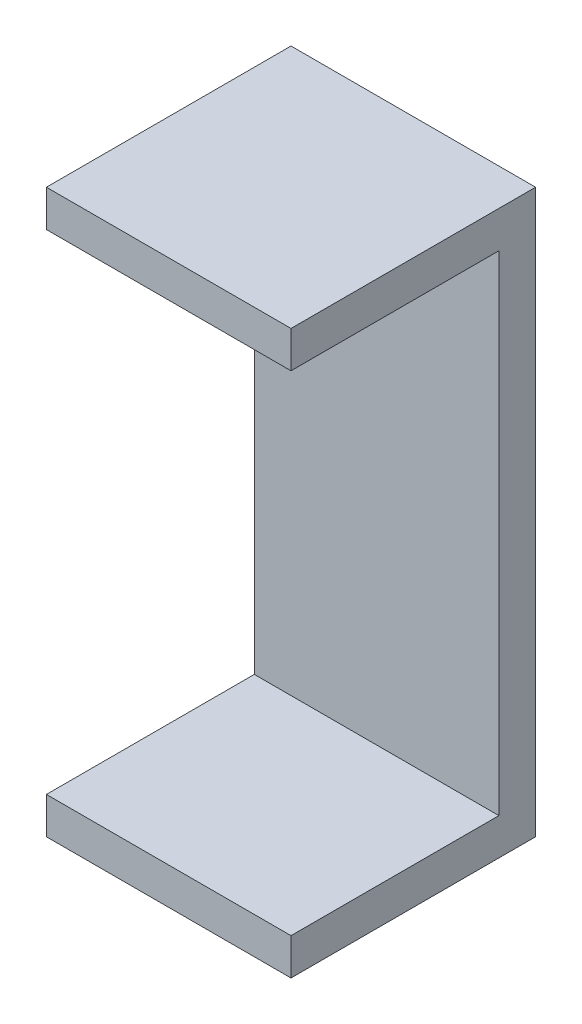
ISO-10303-21;
HEADER;
FILE_DESCRIPTION(('STEP AP214'),'2;1');
FILE_NAME('part.step','',(''),(''),'','','');
FILE_SCHEMA(('AUTOMOTIVE_DESIGN { 1 0 10303 214 1 1 1 1 }'));
ENDSEC;
DATA;
#1=APPLICATION_CONTEXT('core data for automotive mechanical design processes');
#2=APPLICATION_PROTOCOL_DEFINITION('international standard','automotive_design',2000,#1);
#3=PRODUCT_CONTEXT('',#1,'mechanical');
#4=PRODUCT('Part','Part','',(#3));
#5=PRODUCT_RELATED_PRODUCT_CATEGORY('part','',(#4));
#6=PRODUCT_DEFINITION_FORMATION('','',#4);
#7=PRODUCT_DEFINITION_CONTEXT('part definition',#1,'design');
#8=PRODUCT_DEFINITION('design','',#6,#7);
#9=PRODUCT_DEFINITION_SHAPE('','',#8);
#10=(LENGTH_UNIT() NAMED_UNIT(*) SI_UNIT(.MILLI.,.METRE.));
#11=(NAMED_UNIT(*) PLANE_ANGLE_UNIT() SI_UNIT($,.RADIAN.));
#12=(NAMED_UNIT(*) SI_UNIT($,.STERADIAN.) SOLID_ANGLE_UNIT());
#13=UNCERTAINTY_MEASURE_WITH_UNIT(LENGTH_MEASURE(1.E-05),#10,'distance_accuracy_value','');
#14=(GEOMETRIC_REPRESENTATION_CONTEXT(3) GLOBAL_UNCERTAINTY_ASSIGNED_CONTEXT((#13)) GLOBAL_UNIT_ASSIGNED_CONTEXT((#10,
#11,#12)) REPRESENTATION_CONTEXT('',''));
#15=CARTESIAN_POINT('',(0.,0.,0.));
#16=DIRECTION('',(0.,0.,1.));
#17=DIRECTION('',(1.,0.,0.));
#18=AXIS2_PLACEMENT_3D('',#15,#16,#17);
#19=CARTESIAN_POINT('',(10.,20.,3.));
#20=DIRECTION('',(-1.,0.,0.));
#21=DIRECTION('',(0.,-1.,0.));
#22=AXIS2_PLACEMENT_3D('',#19,#20,#21);
#23=PLANE('',#22);
#24=DIRECTION('',(0.,1.,0.));
#25=VECTOR('',#24,1.);
#26=CARTESIAN_POINT('',(10.,20.,0.));
#27=LINE('',#26,#25);
#28=CARTESIAN_POINT('',(10.,-23.,0.));
#29=VERTEX_POINT('',#28);
#30=CARTESIAN_POINT('',(10.,23.,0.));
#31=VERTEX_POINT('',#30);
#32=EDGE_CURVE('E151',#29,#31,#27,.T.);
#33=ORIENTED_EDGE('',*,*,#32,.T.);
#34=DIRECTION('',(0.,0.,-1.));
#35=VECTOR('',#34,1.);
#36=CARTESIAN_POINT('',(10.,23.,20.));
#37=LINE('',#36,#35);
#38=CARTESIAN_POINT('',(10.,23.,20.));
#39=VERTEX_POINT('',#38);
#40=EDGE_CURVE('E148',#39,#31,#37,.T.);
#41=ORIENTED_EDGE('',*,*,#40,.F.);
#42=DIRECTION('',(0.,-1.,0.));
#43=VECTOR('',#42,1.);
#44=CARTESIAN_POINT('',(10.,20.,20.));
#45=LINE('',#44,#43);
#46=CARTESIAN_POINT('',(10.,20.,20.));
#47=VERTEX_POINT('',#46);
#48=EDGE_CURVE('E134',#39,#47,#45,.T.);
#49=ORIENTED_EDGE('',*,*,#48,.T.);
#50=DIRECTION('',(0.,0.,-1.));
#51=VECTOR('',#50,1.);
#52=CARTESIAN_POINT('',(10.,20.,20.));
#53=LINE('',#52,#51);
#54=CARTESIAN_POINT('',(10.,20.,3.));
#55=VERTEX_POINT('',#54);
#56=EDGE_CURVE('E145',#47,#55,#53,.T.);
#57=ORIENTED_EDGE('',*,*,#56,.T.);
#58=DIRECTION('',(0.,1.,0.));
#59=VECTOR('',#58,1.);
#60=CARTESIAN_POINT('',(10.,20.,3.));
#61=LINE('',#60,#59);
#62=CARTESIAN_POINT('',(10.,-20.,3.));
#63=VERTEX_POINT('',#62);
#64=EDGE_CURVE('E158',#63,#55,#61,.T.);
#65=ORIENTED_EDGE('',*,*,#64,.F.);
#66=DIRECTION('',(0.,0.,-1.));
#67=VECTOR('',#66,1.);
#68=CARTESIAN_POINT('',(10.,-20.,20.));
#69=LINE('',#68,#67);
#70=CARTESIAN_POINT('',(10.,-20.,20.));
#71=VERTEX_POINT('',#70);
#72=EDGE_CURVE('E51',#71,#63,#69,.T.);
#73=ORIENTED_EDGE('',*,*,#72,.F.);
#74=DIRECTION('',(0.,-1.,0.));
#75=VECTOR('',#74,1.);
#76=CARTESIAN_POINT('',(10.,-20.,20.));
#77=LINE('',#76,#75);
#78=CARTESIAN_POINT('',(10.,-23.,20.));
#79=VERTEX_POINT('',#78);
#80=EDGE_CURVE('E118',#71,#79,#77,.T.);
#81=ORIENTED_EDGE('',*,*,#80,.T.);
#82=DIRECTION('',(0.,0.,-1.));
#83=VECTOR('',#82,1.);
#84=CARTESIAN_POINT('',(10.,-23.,20.));
#85=LINE('',#84,#83);
#86=EDGE_CURVE('E101',#79,#29,#85,.T.);
#87=ORIENTED_EDGE('',*,*,#86,.T.);
#88=EDGE_LOOP('',(#33,#41,#49,#57,#65,#73,#81,#87));
#89=FACE_BOUND('',#88,.T.);
#90=ADVANCED_FACE('F35',(#89),#23,.F.);
#91=CARTESIAN_POINT('',(-10.,20.,3.));
#92=DIRECTION('',(1.,0.,0.));
#93=DIRECTION('',(0.,1.,0.));
#94=AXIS2_PLACEMENT_3D('',#91,#92,#93);
#95=PLANE('',#94);
#96=DIRECTION('',(0.,-1.,0.));
#97=VECTOR('',#96,1.);
#98=CARTESIAN_POINT('',(-10.,20.,0.));
#99=LINE('',#98,#97);
#100=CARTESIAN_POINT('',(-10.,23.,0.));
#101=VERTEX_POINT('',#100);
#102=CARTESIAN_POINT('',(-10.,-23.,0.));
#103=VERTEX_POINT('',#102);
#104=EDGE_CURVE('E38',#101,#103,#99,.T.);
#105=ORIENTED_EDGE('',*,*,#104,.T.);
#106=DIRECTION('',(0.,0.,-1.));
#107=VECTOR('',#106,1.);
#108=CARTESIAN_POINT('',(-10.,-23.,20.));
#109=LINE('',#108,#107);
#110=CARTESIAN_POINT('',(-10.,-23.,20.));
#111=VERTEX_POINT('',#110);
#112=EDGE_CURVE('E110',#111,#103,#109,.T.);
#113=ORIENTED_EDGE('',*,*,#112,.F.);
#114=DIRECTION('',(0.,1.,0.));
#115=VECTOR('',#114,1.);
#116=CARTESIAN_POINT('',(-10.,-20.,20.));
#117=LINE('',#116,#115);
#118=CARTESIAN_POINT('',(-10.,-20.,20.));
#119=VERTEX_POINT('',#118);
#120=EDGE_CURVE('E120',#111,#119,#117,.T.);
#121=ORIENTED_EDGE('',*,*,#120,.T.);
#122=DIRECTION('',(0.,0.,-1.));
#123=VECTOR('',#122,1.);
#124=CARTESIAN_POINT('',(-10.,-20.,20.));
#125=LINE('',#124,#123);
#126=CARTESIAN_POINT('',(-10.,-20.,3.));
#127=VERTEX_POINT('',#126);
#128=EDGE_CURVE('E130',#119,#127,#125,.T.);
#129=ORIENTED_EDGE('',*,*,#128,.T.);
#130=DIRECTION('',(0.,-1.,0.));
#131=VECTOR('',#130,1.);
#132=CARTESIAN_POINT('',(-10.,20.,3.));
#133=LINE('',#132,#131);
#134=CARTESIAN_POINT('',(-10.,20.,3.));
#135=VERTEX_POINT('',#134);
#136=EDGE_CURVE('E43',#135,#127,#133,.T.);
#137=ORIENTED_EDGE('',*,*,#136,.F.);
#138=DIRECTION('',(0.,0.,-1.));
#139=VECTOR('',#138,1.);
#140=CARTESIAN_POINT('',(-10.,20.,20.));
#141=LINE('',#140,#139);
#142=CARTESIAN_POINT('',(-10.,20.,20.));
#143=VERTEX_POINT('',#142);
#144=EDGE_CURVE('E58',#143,#135,#141,.T.);
#145=ORIENTED_EDGE('',*,*,#144,.F.);
#146=DIRECTION('',(0.,1.,0.));
#147=VECTOR('',#146,1.);
#148=CARTESIAN_POINT('',(-10.,20.,20.));
#149=LINE('',#148,#147);
#150=CARTESIAN_POINT('',(-10.,23.,20.));
#151=VERTEX_POINT('',#150);
#152=EDGE_CURVE('E139',#143,#151,#149,.T.);
#153=ORIENTED_EDGE('',*,*,#152,.T.);
#154=DIRECTION('',(0.,0.,-1.));
#155=VECTOR('',#154,1.);
#156=CARTESIAN_POINT('',(-10.,23.,20.));
#157=LINE('',#156,#155);
#158=EDGE_CURVE('E152',#151,#101,#157,.T.);
#159=ORIENTED_EDGE('',*,*,#158,.T.);
#160=EDGE_LOOP('',(#105,#113,#121,#129,#137,#145,#153,#159));
#161=FACE_BOUND('',#160,.T.);
#162=ADVANCED_FACE('F165',(#161),#95,.F.);
#163=CARTESIAN_POINT('',(0.,0.,3.));
#164=DIRECTION('',(0.,0.,1.));
#165=DIRECTION('',(1.,0.,0.));
#166=AXIS2_PLACEMENT_3D('',#163,#164,#165);
#167=PLANE('',#166);
#168=ORIENTED_EDGE('',*,*,#64,.T.);
#169=DIRECTION('',(-1.,0.,0.));
#170=VECTOR('',#169,1.);
#171=CARTESIAN_POINT('',(-10.,20.,3.));
#172=LINE('',#171,#170);
#173=EDGE_CURVE('E161',#55,#135,#172,.T.);
#174=ORIENTED_EDGE('',*,*,#173,.T.);
#175=ORIENTED_EDGE('',*,*,#136,.T.);
#176=DIRECTION('',(1.,0.,0.));
#177=VECTOR('',#176,1.);
#178=CARTESIAN_POINT('',(-10.,-20.,3.));
#179=LINE('',#178,#177);
#180=EDGE_CURVE('E11',#127,#63,#179,.T.);
#181=ORIENTED_EDGE('',*,*,#180,.T.);
#182=EDGE_LOOP('',(#168,#174,#175,#181));
#183=FACE_BOUND('',#182,.T.);
#184=ADVANCED_FACE('F179',(#183),#167,.T.);
#185=CARTESIAN_POINT('',(0.,0.,0.));
#186=DIRECTION('',(0.,0.,1.));
#187=DIRECTION('',(1.,0.,0.));
#188=AXIS2_PLACEMENT_3D('',#185,#186,#187);
#189=PLANE('',#188);
#190=ORIENTED_EDGE('',*,*,#32,.F.);
#191=DIRECTION('',(-1.,0.,0.));
#192=VECTOR('',#191,1.);
#193=CARTESIAN_POINT('',(10.,-23.,0.));
#194=LINE('',#193,#192);
#195=EDGE_CURVE('E107',#29,#103,#194,.T.);
#196=ORIENTED_EDGE('',*,*,#195,.T.);
#197=ORIENTED_EDGE('',*,*,#104,.F.);
#198=DIRECTION('',(1.,0.,0.));
#199=VECTOR('',#198,1.);
#200=CARTESIAN_POINT('',(10.,23.,0.));
#201=LINE('',#200,#199);
#202=EDGE_CURVE('E129',#101,#31,#201,.T.);
#203=ORIENTED_EDGE('',*,*,#202,.T.);
#204=EDGE_LOOP('',(#190,#196,#197,#203));
#205=FACE_BOUND('',#204,.T.);
#206=ADVANCED_FACE('F168',(#205),#189,.F.);
#207=CARTESIAN_POINT('',(10.,20.,20.));
#208=DIRECTION('',(0.,-1.,0.));
#209=DIRECTION('',(0.,0.,-1.));
#210=AXIS2_PLACEMENT_3D('',#207,#208,#209);
#211=PLANE('',#210);
#212=ORIENTED_EDGE('',*,*,#173,.F.);
#213=ORIENTED_EDGE('',*,*,#56,.F.);
#214=DIRECTION('',(-1.,0.,0.));
#215=VECTOR('',#214,1.);
#216=CARTESIAN_POINT('',(10.,20.,20.));
#217=LINE('',#216,#215);
#218=EDGE_CURVE('E137',#47,#143,#217,.T.);
#219=ORIENTED_EDGE('',*,*,#218,.T.);
#220=ORIENTED_EDGE('',*,*,#144,.T.);
#221=EDGE_LOOP('',(#212,#213,#219,#220));
#222=FACE_BOUND('',#221,.T.);
#223=ADVANCED_FACE('F177',(#222),#211,.T.);
#224=CARTESIAN_POINT('',(10.,23.,20.));
#225=DIRECTION('',(0.,1.,0.));
#226=DIRECTION('',(0.,0.,1.));
#227=AXIS2_PLACEMENT_3D('',#224,#225,#226);
#228=PLANE('',#227);
#229=ORIENTED_EDGE('',*,*,#202,.F.);
#230=ORIENTED_EDGE('',*,*,#158,.F.);
#231=DIRECTION('',(1.,0.,0.));
#232=VECTOR('',#231,1.);
#233=CARTESIAN_POINT('',(10.,23.,20.));
#234=LINE('',#233,#232);
#235=EDGE_CURVE('E142',#151,#39,#234,.T.);
#236=ORIENTED_EDGE('',*,*,#235,.T.);
#237=ORIENTED_EDGE('',*,*,#40,.T.);
#238=EDGE_LOOP('',(#229,#230,#236,#237));
#239=FACE_BOUND('',#238,.T.);
#240=ADVANCED_FACE('F170',(#239),#228,.T.);
#241=CARTESIAN_POINT('',(0.,0.,20.));
#242=DIRECTION('',(0.,0.,1.));
#243=DIRECTION('',(1.,0.,0.));
#244=AXIS2_PLACEMENT_3D('',#241,#242,#243);
#245=PLANE('',#244);
#246=ORIENTED_EDGE('',*,*,#48,.F.);
#247=ORIENTED_EDGE('',*,*,#235,.F.);
#248=ORIENTED_EDGE('',*,*,#152,.F.);
#249=ORIENTED_EDGE('',*,*,#218,.F.);
#250=EDGE_LOOP('',(#246,#247,#248,#249));
#251=FACE_BOUND('',#250,.T.);
#252=ADVANCED_FACE('F175',(#251),#245,.T.);
#253=CARTESIAN_POINT('',(10.,-20.,20.));
#254=DIRECTION('',(0.,1.,0.));
#255=DIRECTION('',(0.,0.,1.));
#256=AXIS2_PLACEMENT_3D('',#253,#254,#255);
#257=PLANE('',#256);
#258=ORIENTED_EDGE('',*,*,#180,.F.);
#259=ORIENTED_EDGE('',*,*,#128,.F.);
#260=DIRECTION('',(1.,0.,0.));
#261=VECTOR('',#260,1.);
#262=CARTESIAN_POINT('',(10.,-20.,20.));
#263=LINE('',#262,#261);
#264=EDGE_CURVE('E111',#119,#71,#263,.T.);
#265=ORIENTED_EDGE('',*,*,#264,.T.);
#266=ORIENTED_EDGE('',*,*,#72,.T.);
#267=EDGE_LOOP('',(#258,#259,#265,#266));
#268=FACE_BOUND('',#267,.T.);
#269=ADVANCED_FACE('F181',(#268),#257,.T.);
#270=CARTESIAN_POINT('',(10.,-23.,20.));
#271=DIRECTION('',(0.,-1.,0.));
#272=DIRECTION('',(0.,0.,-1.));
#273=AXIS2_PLACEMENT_3D('',#270,#271,#272);
#274=PLANE('',#273);
#275=ORIENTED_EDGE('',*,*,#195,.F.);
#276=ORIENTED_EDGE('',*,*,#86,.F.);
#277=DIRECTION('',(-1.,0.,0.));
#278=VECTOR('',#277,1.);
#279=CARTESIAN_POINT('',(10.,-23.,20.));
#280=LINE('',#279,#278);
#281=EDGE_CURVE('E105',#79,#111,#280,.T.);
#282=ORIENTED_EDGE('',*,*,#281,.T.);
#283=ORIENTED_EDGE('',*,*,#112,.T.);
#284=EDGE_LOOP('',(#275,#276,#282,#283));
#285=FACE_BOUND('',#284,.T.);
#286=ADVANCED_FACE('F103',(#285),#274,.T.);
#287=CARTESIAN_POINT('',(0.,0.,20.));
#288=DIRECTION('',(0.,0.,-1.));
#289=DIRECTION('',(-1.,0.,0.));
#290=AXIS2_PLACEMENT_3D('',#287,#288,#289);
#291=PLANE('',#290);
#292=ORIENTED_EDGE('',*,*,#80,.F.);
#293=ORIENTED_EDGE('',*,*,#264,.F.);
#294=ORIENTED_EDGE('',*,*,#120,.F.);
#295=ORIENTED_EDGE('',*,*,#281,.F.);
#296=EDGE_LOOP('',(#292,#293,#294,#295));
#297=FACE_BOUND('',#296,.T.);
#298=ADVANCED_FACE('F116',(#297),#291,.F.);
#299=CLOSED_SHELL('',(#90,#162,#184,#206,#223,#240,#252,#269,#286,#298));
#300=MANIFOLD_SOLID_BREP('B2',#299);
#301=ADVANCED_BREP_SHAPE_REPRESENTATION('',(#18,#300),#14);
#302=SHAPE_DEFINITION_REPRESENTATION(#9,#301);
ENDSEC;
END-ISO-10303-21;
